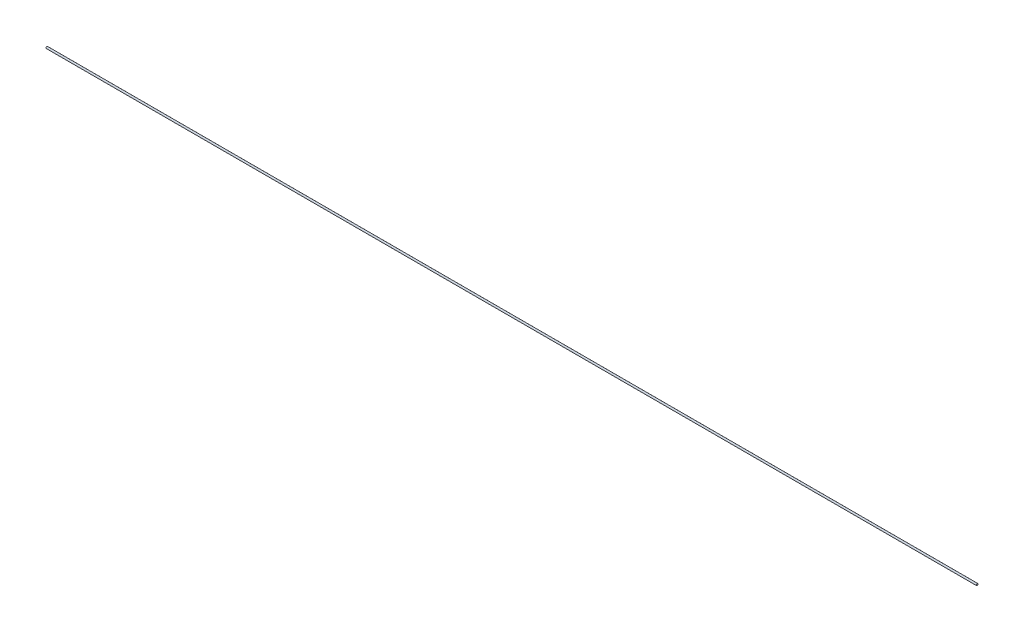
ISO-10303-21;
HEADER;
FILE_DESCRIPTION(('STEP AP214'),'2;1');
FILE_NAME('part.step','',(''),(''),'','','');
FILE_SCHEMA(('AUTOMOTIVE_DESIGN { 1 0 10303 214 1 1 1 1 }'));
ENDSEC;
DATA;
#1=APPLICATION_CONTEXT('core data for automotive mechanical design processes');
#2=APPLICATION_PROTOCOL_DEFINITION('international standard','automotive_design',2000,#1);
#3=PRODUCT_CONTEXT('',#1,'mechanical');
#4=PRODUCT('Part','Part','',(#3));
#5=PRODUCT_RELATED_PRODUCT_CATEGORY('part','',(#4));
#6=PRODUCT_DEFINITION_FORMATION('','',#4);
#7=PRODUCT_DEFINITION_CONTEXT('part definition',#1,'design');
#8=PRODUCT_DEFINITION('design','',#6,#7);
#9=PRODUCT_DEFINITION_SHAPE('','',#8);
#10=(LENGTH_UNIT() NAMED_UNIT(*) SI_UNIT(.MILLI.,.METRE.));
#11=(NAMED_UNIT(*) PLANE_ANGLE_UNIT() SI_UNIT($,.RADIAN.));
#12=(NAMED_UNIT(*) SI_UNIT($,.STERADIAN.) SOLID_ANGLE_UNIT());
#13=UNCERTAINTY_MEASURE_WITH_UNIT(LENGTH_MEASURE(1.E-05),#10,'distance_accuracy_value','');
#14=(GEOMETRIC_REPRESENTATION_CONTEXT(3) GLOBAL_UNCERTAINTY_ASSIGNED_CONTEXT((#13)) GLOBAL_UNIT_ASSIGNED_CONTEXT((#10,
#11,#12)) REPRESENTATION_CONTEXT('',''));
#15=CARTESIAN_POINT('',(0.,0.,0.));
#16=DIRECTION('',(0.,0.,1.));
#17=DIRECTION('',(1.,0.,0.));
#18=AXIS2_PLACEMENT_3D('',#15,#16,#17);
#19=CARTESIAN_POINT('',(-778.215,0.,0.));
#20=DIRECTION('',(1.,0.,0.));
#21=DIRECTION('',(0.,0.,-1.));
#22=AXIS2_PLACEMENT_3D('',#19,#20,#21);
#23=CYLINDRICAL_SURFACE('',#22,1.5);
#24=CARTESIAN_POINT('',(-778.215,0.,0.));
#25=DIRECTION('',(1.,0.,0.));
#26=DIRECTION('',(0.,0.,-1.));
#27=AXIS2_PLACEMENT_3D('',#24,#25,#26);
#28=CIRCLE('',#27,1.5);
#29=CARTESIAN_POINT('',(-778.215,0.,-1.5));
#30=VERTEX_POINT('',#29);
#31=EDGE_CURVE('E10',#30,#30,#28,.T.);
#32=CARTESIAN_POINT('',(778.215,0.,0.));
#33=DIRECTION('',(1.,0.,0.));
#34=DIRECTION('',(0.,0.,-1.));
#35=AXIS2_PLACEMENT_3D('',#32,#33,#34);
#36=CIRCLE('',#35,1.5);
#37=CARTESIAN_POINT('',(778.215,0.,-1.5));
#38=VERTEX_POINT('',#37);
#39=EDGE_CURVE('E44',#38,#38,#36,.T.);
#40=CARTESIAN_POINT('',(-778.215,0.,-1.5));
#41=CARTESIAN_POINT('',(-762.0021875,0.,-1.5));
#42=CARTESIAN_POINT('',(-745.789375,0.,-1.5));
#43=CARTESIAN_POINT('',(-713.36375,0.,-1.5));
#44=CARTESIAN_POINT('',(-697.1509375,0.,-1.5));
#45=CARTESIAN_POINT('',(-664.7253125,0.,-1.5));
#46=CARTESIAN_POINT('',(-648.5125,0.,-1.5));
#47=CARTESIAN_POINT('',(-616.086875,0.,-1.5));
#48=CARTESIAN_POINT('',(-599.8740625,0.,-1.5));
#49=CARTESIAN_POINT('',(-567.4484375,0.,-1.5));
#50=CARTESIAN_POINT('',(-551.235625,0.,-1.5));
#51=CARTESIAN_POINT('',(-518.81,0.,-1.5));
#52=CARTESIAN_POINT('',(-502.5971875,0.,-1.5));
#53=CARTESIAN_POINT('',(-470.1715625,0.,-1.5));
#54=CARTESIAN_POINT('',(-453.95875,0.,-1.5));
#55=CARTESIAN_POINT('',(-421.533125,0.,-1.5));
#56=CARTESIAN_POINT('',(-405.3203125,0.,-1.5));
#57=CARTESIAN_POINT('',(-372.8946875,0.,-1.5));
#58=CARTESIAN_POINT('',(-356.681875,0.,-1.5));
#59=CARTESIAN_POINT('',(-324.25625,0.,-1.5));
#60=CARTESIAN_POINT('',(-308.0434375,0.,-1.5));
#61=CARTESIAN_POINT('',(-275.6178125,0.,-1.5));
#62=CARTESIAN_POINT('',(-259.405,0.,-1.5));
#63=CARTESIAN_POINT('',(-226.979375,0.,-1.5));
#64=CARTESIAN_POINT('',(-210.7665625,0.,-1.5));
#65=CARTESIAN_POINT('',(-178.3409375,0.,-1.5));
#66=CARTESIAN_POINT('',(-162.128125,0.,-1.5));
#67=CARTESIAN_POINT('',(-129.7025,0.,-1.5));
#68=CARTESIAN_POINT('',(-113.4896875,0.,-1.5));
#69=CARTESIAN_POINT('',(-81.0640625000001,0.,-1.5));
#70=CARTESIAN_POINT('',(-64.8512500000001,0.,-1.5));
#71=CARTESIAN_POINT('',(-32.4256250000001,0.,-1.5));
#72=CARTESIAN_POINT('',(-16.2128125000001,0.,-1.5));
#73=CARTESIAN_POINT('',(16.2128124999999,0.,-1.5));
#74=CARTESIAN_POINT('',(32.4256249999999,0.,-1.5));
#75=CARTESIAN_POINT('',(64.8512499999999,0.,-1.5));
#76=CARTESIAN_POINT('',(81.0640624999999,0.,-1.5));
#77=CARTESIAN_POINT('',(113.4896875,0.,-1.5));
#78=CARTESIAN_POINT('',(129.7025,0.,-1.5));
#79=CARTESIAN_POINT('',(162.128125,0.,-1.5));
#80=CARTESIAN_POINT('',(178.3409375,0.,-1.5));
#81=CARTESIAN_POINT('',(210.7665625,0.,-1.5));
#82=CARTESIAN_POINT('',(226.979375,0.,-1.5));
#83=CARTESIAN_POINT('',(259.405,0.,-1.5));
#84=CARTESIAN_POINT('',(275.6178125,0.,-1.5));
#85=CARTESIAN_POINT('',(308.0434375,0.,-1.5));
#86=CARTESIAN_POINT('',(324.25625,0.,-1.5));
#87=CARTESIAN_POINT('',(356.681875,0.,-1.5));
#88=CARTESIAN_POINT('',(372.8946875,0.,-1.5));
#89=CARTESIAN_POINT('',(405.3203125,0.,-1.5));
#90=CARTESIAN_POINT('',(421.533125,0.,-1.5));
#91=CARTESIAN_POINT('',(453.95875,0.,-1.5));
#92=CARTESIAN_POINT('',(470.1715625,0.,-1.5));
#93=CARTESIAN_POINT('',(502.5971875,0.,-1.5));
#94=CARTESIAN_POINT('',(518.81,0.,-1.5));
#95=CARTESIAN_POINT('',(551.235625,0.,-1.5));
#96=CARTESIAN_POINT('',(567.4484375,0.,-1.5));
#97=CARTESIAN_POINT('',(599.8740625,0.,-1.5));
#98=CARTESIAN_POINT('',(616.086875,0.,-1.5));
#99=CARTESIAN_POINT('',(648.5125,0.,-1.5));
#100=CARTESIAN_POINT('',(664.7253125,0.,-1.5));
#101=CARTESIAN_POINT('',(697.1509375,0.,-1.5));
#102=CARTESIAN_POINT('',(713.36375,0.,-1.5));
#103=CARTESIAN_POINT('',(745.789375,0.,-1.5));
#104=CARTESIAN_POINT('',(762.0021875,0.,-1.5));
#105=CARTESIAN_POINT('',(778.215,0.,-1.5));
#106=B_SPLINE_CURVE_WITH_KNOTS('',3,(#40,#41,#42,#43,#44,#45,#46,#47,#48,#49,#50,#51,#52,#53,
#54,#55,#56,#57,#58,#59,#60,#61,#62,#63,#64,#65,#66,#67,#68,#69,#70,#71,#72,#73,#74,#75,#76,#77,
#78,#79,#80,#81,#82,#83,#84,#85,#86,#87,#88,#89,#90,#91,#92,#93,#94,#95,#96,#97,#98,#99,#100,
#101,#102,#103,#104,#105),.UNSPECIFIED.,.F.,.F.,(4,2,2,2,2,2,2,2,2,2,2,2,2,2,2,2,2,2,2,2,2,2,2,
2,2,2,2,2,2,2,2,2,4),(0.,48.6384375000001,97.276875,145.9153125,194.55375,243.1921875,
291.830625,340.4690625,389.1075,437.7459375,486.384375,535.0228125,583.66125,632.2996875,
680.938125,729.5765625,778.215,826.8534375,875.491875,924.1303125,972.76875,1021.4071875,
1070.045625,1118.6840625,1167.3225,1215.9609375,1264.599375,1313.2378125,1361.87625,
1410.5146875,1459.153125,1507.7915625,1556.43),.UNSPECIFIED.);
#107=EDGE_CURVE('BSEAM37',#30,#38,#106,.T.);
#108=ORIENTED_EDGE('',*,*,#31,.T.);
#109=ORIENTED_EDGE('',*,*,#39,.F.);
#110=ORIENTED_EDGE('',*,*,#107,.T.);
#111=ORIENTED_EDGE('',*,*,#107,.F.);
#112=EDGE_LOOP('',(#108,#110,#109,#111));
#113=FACE_BOUND('',#112,.T.);
#114=ADVANCED_FACE('F37',(#113),#23,.T.);
#115=CARTESIAN_POINT('',(-778.215,0.,0.));
#116=DIRECTION('',(1.,0.,0.));
#117=DIRECTION('',(0.,0.,-1.));
#118=AXIS2_PLACEMENT_3D('',#115,#116,#117);
#119=PLANE('',#118);
#120=ORIENTED_EDGE('',*,*,#31,.F.);
#121=EDGE_LOOP('',(#120));
#122=FACE_BOUND('',#121,.T.);
#123=ADVANCED_FACE('F54',(#122),#119,.F.);
#124=CARTESIAN_POINT('',(778.215,0.,0.));
#125=DIRECTION('',(1.,0.,0.));
#126=DIRECTION('',(0.,0.,-1.));
#127=AXIS2_PLACEMENT_3D('',#124,#125,#126);
#128=PLANE('',#127);
#129=ORIENTED_EDGE('',*,*,#39,.T.);
#130=EDGE_LOOP('',(#129));
#131=FACE_BOUND('',#130,.T.);
#132=ADVANCED_FACE('F51',(#131),#128,.T.);
#133=CLOSED_SHELL('',(#114,#123,#132));
#134=MANIFOLD_SOLID_BREP('B2',#133);
#135=ADVANCED_BREP_SHAPE_REPRESENTATION('',(#18,#134),#14);
#136=SHAPE_DEFINITION_REPRESENTATION(#9,#135);
ENDSEC;
END-ISO-10303-21;
